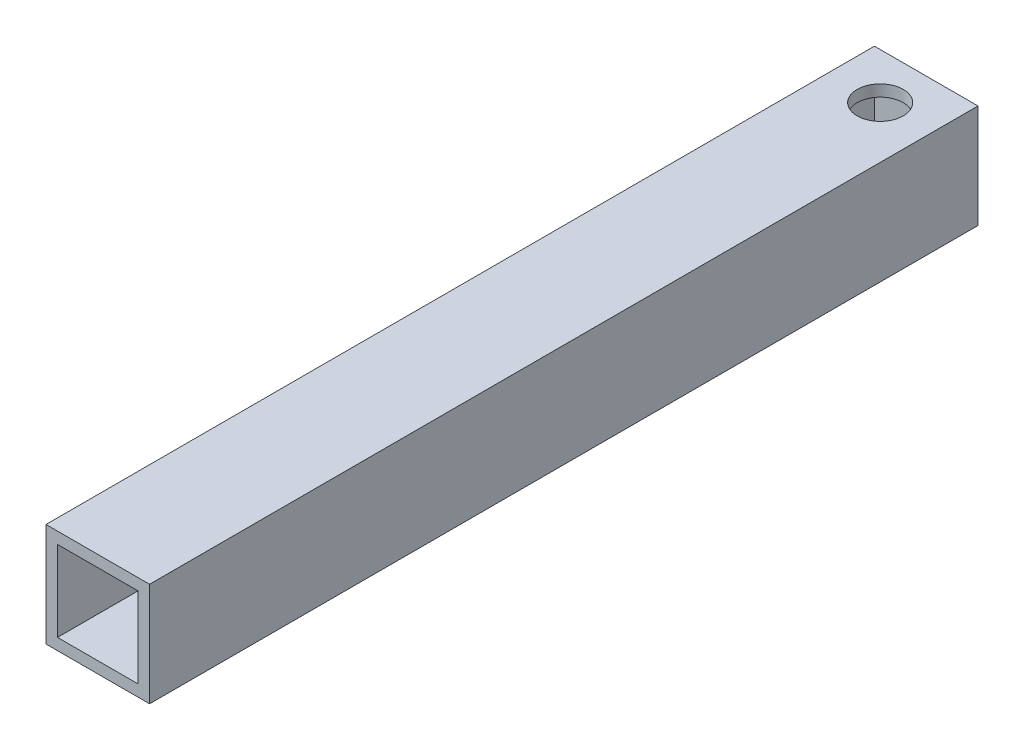
ISO-10303-21;
HEADER;
FILE_DESCRIPTION(('STEP AP214'),'2;1');
FILE_NAME('part.step','',(''),(''),'','','');
FILE_SCHEMA(('AUTOMOTIVE_DESIGN { 1 0 10303 214 1 1 1 1 }'));
ENDSEC;
DATA;
#1=APPLICATION_CONTEXT('core data for automotive mechanical design processes');
#2=APPLICATION_PROTOCOL_DEFINITION('international standard','automotive_design',2000,#1);
#3=PRODUCT_CONTEXT('',#1,'mechanical');
#4=PRODUCT('Part','Part','',(#3));
#5=PRODUCT_RELATED_PRODUCT_CATEGORY('part','',(#4));
#6=PRODUCT_DEFINITION_FORMATION('','',#4);
#7=PRODUCT_DEFINITION_CONTEXT('part definition',#1,'design');
#8=PRODUCT_DEFINITION('design','',#6,#7);
#9=PRODUCT_DEFINITION_SHAPE('','',#8);
#10=(LENGTH_UNIT() NAMED_UNIT(*) SI_UNIT(.MILLI.,.METRE.));
#11=(NAMED_UNIT(*) PLANE_ANGLE_UNIT() SI_UNIT($,.RADIAN.));
#12=(NAMED_UNIT(*) SI_UNIT($,.STERADIAN.) SOLID_ANGLE_UNIT());
#13=UNCERTAINTY_MEASURE_WITH_UNIT(LENGTH_MEASURE(1.E-05),#10,'distance_accuracy_value','');
#14=(GEOMETRIC_REPRESENTATION_CONTEXT(3) GLOBAL_UNCERTAINTY_ASSIGNED_CONTEXT((#13)) GLOBAL_UNIT_ASSIGNED_CONTEXT((#10,
#11,#12)) REPRESENTATION_CONTEXT('',''));
#15=CARTESIAN_POINT('',(0.,0.,0.));
#16=DIRECTION('',(0.,0.,1.));
#17=DIRECTION('',(1.,0.,0.));
#18=AXIS2_PLACEMENT_3D('',#15,#16,#17);
#19=CARTESIAN_POINT('',(22.225,-22.225,457.2));
#20=DIRECTION('',(-1.,0.,0.));
#21=DIRECTION('',(0.,0.,1.));
#22=AXIS2_PLACEMENT_3D('',#19,#20,#21);
#23=PLANE('',#22);
#24=DIRECTION('',(0.,0.,-1.));
#25=VECTOR('',#24,1.);
#26=CARTESIAN_POINT('',(22.225,22.225,457.2));
#27=LINE('',#26,#25);
#28=CARTESIAN_POINT('',(22.225,22.225,457.2));
#29=VERTEX_POINT('',#28);
#30=CARTESIAN_POINT('',(22.225,22.225,6.35000000000002));
#31=VERTEX_POINT('',#30);
#32=EDGE_CURVE('E110',#29,#31,#27,.T.);
#33=ORIENTED_EDGE('',*,*,#32,.T.);
#34=DIRECTION('',(0.,-1.,0.));
#35=VECTOR('',#34,1.);
#36=CARTESIAN_POINT('',(22.225,67.1262806053458,6.35000000000002));
#37=LINE('',#36,#35);
#38=CARTESIAN_POINT('',(22.225,-22.225,6.35000000000002));
#39=VERTEX_POINT('',#38);
#40=EDGE_CURVE('E99',#31,#39,#37,.T.);
#41=ORIENTED_EDGE('',*,*,#40,.T.);
#42=DIRECTION('',(0.,0.,-1.));
#43=VECTOR('',#42,1.);
#44=CARTESIAN_POINT('',(22.225,-22.225,457.2));
#45=LINE('',#44,#43);
#46=CARTESIAN_POINT('',(22.225,-22.225,457.2));
#47=VERTEX_POINT('',#46);
#48=EDGE_CURVE('E107',#47,#39,#45,.T.);
#49=ORIENTED_EDGE('',*,*,#48,.F.);
#50=DIRECTION('',(0.,1.,0.));
#51=VECTOR('',#50,1.);
#52=CARTESIAN_POINT('',(22.225,-22.225,457.2));
#53=LINE('',#52,#51);
#54=EDGE_CURVE('E210',#47,#29,#53,.T.);
#55=ORIENTED_EDGE('',*,*,#54,.T.);
#56=EDGE_LOOP('',(#33,#41,#49,#55));
#57=FACE_BOUND('',#56,.T.);
#58=ADVANCED_FACE('F34',(#57),#23,.T.);
#59=CARTESIAN_POINT('',(-22.225,22.225,457.2));
#60=DIRECTION('',(0.,-1.,0.));
#61=DIRECTION('',(0.,0.,-1.));
#62=AXIS2_PLACEMENT_3D('',#59,#60,#61);
#63=PLANE('',#62);
#64=CARTESIAN_POINT('',(0.,22.225,25.4));
#65=DIRECTION('',(0.,-1.,0.));
#66=DIRECTION('',(0.,0.,-1.));
#67=AXIS2_PLACEMENT_3D('',#64,#65,#66);
#68=CIRCLE('',#67,12.7);
#69=CARTESIAN_POINT('',(0.,22.225,12.7));
#70=VERTEX_POINT('',#69);
#71=EDGE_CURVE('E102',#70,#70,#68,.F.);
#72=ORIENTED_EDGE('',*,*,#71,.T.);
#73=EDGE_LOOP('',(#72));
#74=FACE_BOUND('',#73,.T.);
#75=DIRECTION('',(0.,0.,-1.));
#76=VECTOR('',#75,1.);
#77=CARTESIAN_POINT('',(-22.225,22.225,457.2));
#78=LINE('',#77,#76);
#79=CARTESIAN_POINT('',(-22.225,22.225,457.2));
#80=VERTEX_POINT('',#79);
#81=CARTESIAN_POINT('',(-22.225,22.225,6.35));
#82=VERTEX_POINT('',#81);
#83=EDGE_CURVE('E116',#80,#82,#78,.T.);
#84=ORIENTED_EDGE('',*,*,#83,.T.);
#85=DIRECTION('',(-1.,0.,0.));
#86=VECTOR('',#85,1.);
#87=CARTESIAN_POINT('',(-22.225,22.225,6.35));
#88=LINE('',#87,#86);
#89=EDGE_CURVE('E209',#31,#82,#88,.T.);
#90=ORIENTED_EDGE('',*,*,#89,.F.);
#91=ORIENTED_EDGE('',*,*,#32,.F.);
#92=DIRECTION('',(-1.,0.,0.));
#93=VECTOR('',#92,1.);
#94=CARTESIAN_POINT('',(-22.225,22.225,457.2));
#95=LINE('',#94,#93);
#96=EDGE_CURVE('E214',#29,#80,#95,.T.);
#97=ORIENTED_EDGE('',*,*,#96,.T.);
#98=EDGE_LOOP('',(#84,#90,#91,#97));
#99=FACE_BOUND('',#98,.T.);
#100=ADVANCED_FACE('F178',(#74,#99),#63,.T.);
#101=CARTESIAN_POINT('',(-22.225,-22.225,457.2));
#102=DIRECTION('',(1.,0.,0.));
#103=DIRECTION('',(0.,0.,-1.));
#104=AXIS2_PLACEMENT_3D('',#101,#102,#103);
#105=PLANE('',#104);
#106=DIRECTION('',(0.,0.,-1.));
#107=VECTOR('',#106,1.);
#108=CARTESIAN_POINT('',(-22.225,-22.225,457.2));
#109=LINE('',#108,#107);
#110=CARTESIAN_POINT('',(-22.225,-22.225,457.2));
#111=VERTEX_POINT('',#110);
#112=CARTESIAN_POINT('',(-22.225,-22.225,6.35000000000002));
#113=VERTEX_POINT('',#112);
#114=EDGE_CURVE('E56',#111,#113,#109,.T.);
#115=ORIENTED_EDGE('',*,*,#114,.T.);
#116=DIRECTION('',(0.,-1.,0.));
#117=VECTOR('',#116,1.);
#118=CARTESIAN_POINT('',(-22.225,67.1262806053458,6.35));
#119=LINE('',#118,#117);
#120=EDGE_CURVE('E49',#82,#113,#119,.T.);
#121=ORIENTED_EDGE('',*,*,#120,.F.);
#122=ORIENTED_EDGE('',*,*,#83,.F.);
#123=DIRECTION('',(0.,-1.,0.));
#124=VECTOR('',#123,1.);
#125=CARTESIAN_POINT('',(-22.225,-22.225,457.2));
#126=LINE('',#125,#124);
#127=EDGE_CURVE('E118',#80,#111,#126,.T.);
#128=ORIENTED_EDGE('',*,*,#127,.T.);
#129=EDGE_LOOP('',(#115,#121,#122,#128));
#130=FACE_BOUND('',#129,.T.);
#131=ADVANCED_FACE('F184',(#130),#105,.T.);
#132=CARTESIAN_POINT('',(-22.225,-22.225,457.2));
#133=DIRECTION('',(0.,1.,0.));
#134=DIRECTION('',(0.,0.,1.));
#135=AXIS2_PLACEMENT_3D('',#132,#133,#134);
#136=PLANE('',#135);
#137=ORIENTED_EDGE('',*,*,#48,.T.);
#138=DIRECTION('',(1.,0.,0.));
#139=VECTOR('',#138,1.);
#140=CARTESIAN_POINT('',(-22.225,-22.225,6.35));
#141=LINE('',#140,#139);
#142=EDGE_CURVE('E96',#113,#39,#141,.T.);
#143=ORIENTED_EDGE('',*,*,#142,.F.);
#144=ORIENTED_EDGE('',*,*,#114,.F.);
#145=DIRECTION('',(1.,0.,0.));
#146=VECTOR('',#145,1.);
#147=CARTESIAN_POINT('',(-22.225,-22.225,457.2));
#148=LINE('',#147,#146);
#149=EDGE_CURVE('E114',#111,#47,#148,.T.);
#150=ORIENTED_EDGE('',*,*,#149,.T.);
#151=EDGE_LOOP('',(#137,#143,#144,#150));
#152=FACE_BOUND('',#151,.T.);
#153=ADVANCED_FACE('F112',(#152),#136,.T.);
#154=CARTESIAN_POINT('',(0.,0.,457.2));
#155=DIRECTION('',(0.,0.,-1.));
#156=DIRECTION('',(-1.,0.,0.));
#157=AXIS2_PLACEMENT_3D('',#154,#155,#156);
#158=PLANE('',#157);
#159=DIRECTION('',(0.,-1.,0.));
#160=VECTOR('',#159,1.);
#161=CARTESIAN_POINT('',(-28.575,-28.575,457.2));
#162=LINE('',#161,#160);
#163=CARTESIAN_POINT('',(-28.575,28.575,457.2));
#164=VERTEX_POINT('',#163);
#165=CARTESIAN_POINT('',(-28.575,-28.575,457.2));
#166=VERTEX_POINT('',#165);
#167=EDGE_CURVE('E126',#164,#166,#162,.T.);
#168=ORIENTED_EDGE('',*,*,#167,.T.);
#169=DIRECTION('',(1.,0.,0.));
#170=VECTOR('',#169,1.);
#171=CARTESIAN_POINT('',(-28.575,-28.575,457.2));
#172=LINE('',#171,#170);
#173=CARTESIAN_POINT('',(28.575,-28.575,457.2));
#174=VERTEX_POINT('',#173);
#175=EDGE_CURVE('E129',#166,#174,#172,.T.);
#176=ORIENTED_EDGE('',*,*,#175,.T.);
#177=DIRECTION('',(0.,1.,0.));
#178=VECTOR('',#177,1.);
#179=CARTESIAN_POINT('',(28.575,-28.575,457.2));
#180=LINE('',#179,#178);
#181=CARTESIAN_POINT('',(28.575,28.575,457.2));
#182=VERTEX_POINT('',#181);
#183=EDGE_CURVE('E132',#174,#182,#180,.T.);
#184=ORIENTED_EDGE('',*,*,#183,.T.);
#185=DIRECTION('',(-1.,0.,0.));
#186=VECTOR('',#185,1.);
#187=CARTESIAN_POINT('',(-28.575,28.575,457.2));
#188=LINE('',#187,#186);
#189=EDGE_CURVE('E134',#182,#164,#188,.T.);
#190=ORIENTED_EDGE('',*,*,#189,.T.);
#191=EDGE_LOOP('',(#168,#176,#184,#190));
#192=FACE_BOUND('',#191,.T.);
#193=ORIENTED_EDGE('',*,*,#54,.F.);
#194=ORIENTED_EDGE('',*,*,#149,.F.);
#195=ORIENTED_EDGE('',*,*,#127,.F.);
#196=ORIENTED_EDGE('',*,*,#96,.F.);
#197=EDGE_LOOP('',(#193,#194,#195,#196));
#198=FACE_BOUND('',#197,.T.);
#199=ADVANCED_FACE('F168',(#192,#198),#158,.F.);
#200=CARTESIAN_POINT('',(0.,0.,0.));
#201=DIRECTION('',(0.,0.,-1.));
#202=DIRECTION('',(-1.,0.,0.));
#203=AXIS2_PLACEMENT_3D('',#200,#201,#202);
#204=PLANE('',#203);
#205=DIRECTION('',(0.,-1.,0.));
#206=VECTOR('',#205,1.);
#207=CARTESIAN_POINT('',(-28.575,-28.575,0.));
#208=LINE('',#207,#206);
#209=CARTESIAN_POINT('',(-28.575,28.575,0.));
#210=VERTEX_POINT('',#209);
#211=CARTESIAN_POINT('',(-28.575,-28.575,0.));
#212=VERTEX_POINT('',#211);
#213=EDGE_CURVE('E125',#210,#212,#208,.T.);
#214=ORIENTED_EDGE('',*,*,#213,.F.);
#215=DIRECTION('',(-1.,0.,0.));
#216=VECTOR('',#215,1.);
#217=CARTESIAN_POINT('',(-28.575,28.575,0.));
#218=LINE('',#217,#216);
#219=CARTESIAN_POINT('',(28.575,28.575,0.));
#220=VERTEX_POINT('',#219);
#221=EDGE_CURVE('E130',#220,#210,#218,.T.);
#222=ORIENTED_EDGE('',*,*,#221,.F.);
#223=DIRECTION('',(0.,1.,0.));
#224=VECTOR('',#223,1.);
#225=CARTESIAN_POINT('',(28.575,-28.575,0.));
#226=LINE('',#225,#224);
#227=CARTESIAN_POINT('',(28.575,-28.575,0.));
#228=VERTEX_POINT('',#227);
#229=EDGE_CURVE('E141',#228,#220,#226,.T.);
#230=ORIENTED_EDGE('',*,*,#229,.F.);
#231=DIRECTION('',(1.,0.,0.));
#232=VECTOR('',#231,1.);
#233=CARTESIAN_POINT('',(-28.575,-28.575,0.));
#234=LINE('',#233,#232);
#235=EDGE_CURVE('E139',#212,#228,#234,.T.);
#236=ORIENTED_EDGE('',*,*,#235,.F.);
#237=EDGE_LOOP('',(#214,#222,#230,#236));
#238=FACE_BOUND('',#237,.T.);
#239=ADVANCED_FACE('F159',(#238),#204,.T.);
#240=CARTESIAN_POINT('',(-28.575,-28.575,457.2));
#241=DIRECTION('',(1.,0.,0.));
#242=DIRECTION('',(0.,0.,-1.));
#243=AXIS2_PLACEMENT_3D('',#240,#241,#242);
#244=PLANE('',#243);
#245=ORIENTED_EDGE('',*,*,#213,.T.);
#246=DIRECTION('',(0.,0.,-1.));
#247=VECTOR('',#246,1.);
#248=CARTESIAN_POINT('',(-28.575,-28.575,457.2));
#249=LINE('',#248,#247);
#250=EDGE_CURVE('E11',#166,#212,#249,.T.);
#251=ORIENTED_EDGE('',*,*,#250,.F.);
#252=ORIENTED_EDGE('',*,*,#167,.F.);
#253=DIRECTION('',(0.,0.,-1.));
#254=VECTOR('',#253,1.);
#255=CARTESIAN_POINT('',(-28.575,28.575,457.2));
#256=LINE('',#255,#254);
#257=EDGE_CURVE('E136',#164,#210,#256,.T.);
#258=ORIENTED_EDGE('',*,*,#257,.T.);
#259=EDGE_LOOP('',(#245,#251,#252,#258));
#260=FACE_BOUND('',#259,.T.);
#261=ADVANCED_FACE('F36',(#260),#244,.F.);
#262=CARTESIAN_POINT('',(-28.575,-28.575,457.2));
#263=DIRECTION('',(0.,1.,0.));
#264=DIRECTION('',(0.,0.,1.));
#265=AXIS2_PLACEMENT_3D('',#262,#263,#264);
#266=PLANE('',#265);
#267=ORIENTED_EDGE('',*,*,#235,.T.);
#268=DIRECTION('',(0.,0.,-1.));
#269=VECTOR('',#268,1.);
#270=CARTESIAN_POINT('',(28.575,-28.575,457.2));
#271=LINE('',#270,#269);
#272=EDGE_CURVE('E42',#174,#228,#271,.T.);
#273=ORIENTED_EDGE('',*,*,#272,.F.);
#274=ORIENTED_EDGE('',*,*,#175,.F.);
#275=ORIENTED_EDGE('',*,*,#250,.T.);
#276=EDGE_LOOP('',(#267,#273,#274,#275));
#277=FACE_BOUND('',#276,.T.);
#278=ADVANCED_FACE('F170',(#277),#266,.F.);
#279=CARTESIAN_POINT('',(28.575,-28.575,457.2));
#280=DIRECTION('',(-1.,0.,0.));
#281=DIRECTION('',(0.,-1.,0.));
#282=AXIS2_PLACEMENT_3D('',#279,#280,#281);
#283=PLANE('',#282);
#284=ORIENTED_EDGE('',*,*,#229,.T.);
#285=DIRECTION('',(0.,0.,-1.));
#286=VECTOR('',#285,1.);
#287=CARTESIAN_POINT('',(28.575,28.575,457.2));
#288=LINE('',#287,#286);
#289=EDGE_CURVE('E146',#182,#220,#288,.T.);
#290=ORIENTED_EDGE('',*,*,#289,.F.);
#291=ORIENTED_EDGE('',*,*,#183,.F.);
#292=ORIENTED_EDGE('',*,*,#272,.T.);
#293=EDGE_LOOP('',(#284,#290,#291,#292));
#294=FACE_BOUND('',#293,.T.);
#295=ADVANCED_FACE('F153',(#294),#283,.F.);
#296=CARTESIAN_POINT('',(-28.575,28.575,457.2));
#297=DIRECTION('',(0.,-1.,0.));
#298=DIRECTION('',(0.,0.,-1.));
#299=AXIS2_PLACEMENT_3D('',#296,#297,#298);
#300=PLANE('',#299);
#301=CARTESIAN_POINT('',(0.,28.575,25.4));
#302=DIRECTION('',(0.,1.,0.));
#303=DIRECTION('',(0.,0.,1.));
#304=AXIS2_PLACEMENT_3D('',#301,#302,#303);
#305=CIRCLE('',#304,12.7);
#306=CARTESIAN_POINT('',(0.,28.575,38.1));
#307=VERTEX_POINT('',#306);
#308=EDGE_CURVE('E203',#307,#307,#305,.T.);
#309=ORIENTED_EDGE('',*,*,#308,.F.);
#310=EDGE_LOOP('',(#309));
#311=FACE_BOUND('',#310,.T.);
#312=ORIENTED_EDGE('',*,*,#221,.T.);
#313=ORIENTED_EDGE('',*,*,#257,.F.);
#314=ORIENTED_EDGE('',*,*,#189,.F.);
#315=ORIENTED_EDGE('',*,*,#289,.T.);
#316=EDGE_LOOP('',(#312,#313,#314,#315));
#317=FACE_BOUND('',#316,.T.);
#318=ADVANCED_FACE('F162',(#311,#317),#300,.F.);
#319=CARTESIAN_POINT('',(-22.225,67.1262806053458,6.35));
#320=DIRECTION('',(0.,0.,-1.));
#321=DIRECTION('',(-1.,0.,0.));
#322=AXIS2_PLACEMENT_3D('',#319,#320,#321);
#323=PLANE('',#322);
#324=ORIENTED_EDGE('',*,*,#40,.F.);
#325=ORIENTED_EDGE('',*,*,#89,.T.);
#326=ORIENTED_EDGE('',*,*,#120,.T.);
#327=ORIENTED_EDGE('',*,*,#142,.T.);
#328=EDGE_LOOP('',(#324,#325,#326,#327));
#329=FACE_BOUND('',#328,.T.);
#330=ADVANCED_FACE('F98',(#329),#323,.F.);
#331=CARTESIAN_POINT('',(0.,-13.6960244842766,25.4));
#332=DIRECTION('',(0.,1.,0.));
#333=DIRECTION('',(0.,0.,1.));
#334=AXIS2_PLACEMENT_3D('',#331,#332,#333);
#335=CYLINDRICAL_SURFACE('',#334,12.7);
#336=ORIENTED_EDGE('',*,*,#308,.T.);
#337=EDGE_LOOP('',(#336));
#338=FACE_BOUND('',#337,.T.);
#339=ORIENTED_EDGE('',*,*,#71,.F.);
#340=EDGE_LOOP('',(#339));
#341=FACE_BOUND('',#340,.T.);
#342=ADVANCED_FACE('F199',(#338,#341),#335,.F.);
#343=CLOSED_SHELL('',(#58,#100,#131,#153,#199,#239,#261,#278,#295,#318,#330,#342));
#344=MANIFOLD_SOLID_BREP('B2',#343);
#345=ADVANCED_BREP_SHAPE_REPRESENTATION('',(#18,#344),#14);
#346=SHAPE_DEFINITION_REPRESENTATION(#9,#345);
ENDSEC;
END-ISO-10303-21;
